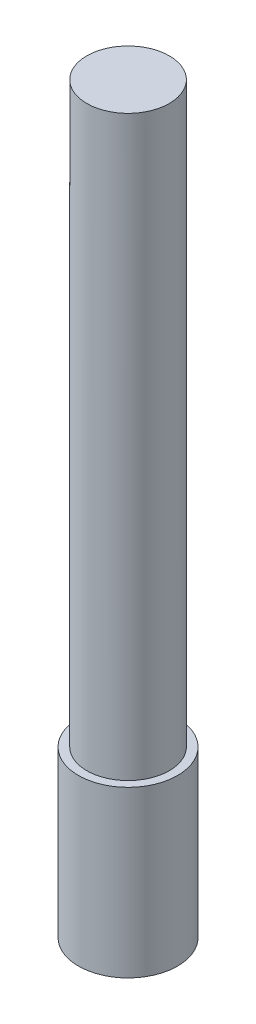
ISO-10303-21;
HEADER;
FILE_DESCRIPTION(('STEP AP214'),'2;1');
FILE_NAME('part.step','',(''),(''),'','','');
FILE_SCHEMA(('AUTOMOTIVE_DESIGN { 1 0 10303 214 1 1 1 1 }'));
ENDSEC;
DATA;
#1=APPLICATION_CONTEXT('core data for automotive mechanical design processes');
#2=APPLICATION_PROTOCOL_DEFINITION('international standard','automotive_design',2000,#1);
#3=PRODUCT_CONTEXT('',#1,'mechanical');
#4=PRODUCT('Part','Part','',(#3));
#5=PRODUCT_RELATED_PRODUCT_CATEGORY('part','',(#4));
#6=PRODUCT_DEFINITION_FORMATION('','',#4);
#7=PRODUCT_DEFINITION_CONTEXT('part definition',#1,'design');
#8=PRODUCT_DEFINITION('design','',#6,#7);
#9=PRODUCT_DEFINITION_SHAPE('','',#8);
#10=(LENGTH_UNIT() NAMED_UNIT(*) SI_UNIT(.MILLI.,.METRE.));
#11=(NAMED_UNIT(*) PLANE_ANGLE_UNIT() SI_UNIT($,.RADIAN.));
#12=(NAMED_UNIT(*) SI_UNIT($,.STERADIAN.) SOLID_ANGLE_UNIT());
#13=UNCERTAINTY_MEASURE_WITH_UNIT(LENGTH_MEASURE(1.E-05),#10,'distance_accuracy_value','');
#14=(GEOMETRIC_REPRESENTATION_CONTEXT(3) GLOBAL_UNCERTAINTY_ASSIGNED_CONTEXT((#13)) GLOBAL_UNIT_ASSIGNED_CONTEXT((#10,
#11,#12)) REPRESENTATION_CONTEXT('',''));
#15=CARTESIAN_POINT('',(0.,0.,0.));
#16=DIRECTION('',(0.,0.,1.));
#17=DIRECTION('',(1.,0.,0.));
#18=AXIS2_PLACEMENT_3D('',#15,#16,#17);
#19=CARTESIAN_POINT('',(0.,0.,0.));
#20=DIRECTION('',(0.,-1.,0.));
#21=DIRECTION('',(0.,0.,-1.));
#22=AXIS2_PLACEMENT_3D('',#19,#20,#21);
#23=CYLINDRICAL_SURFACE('',#22,0.5);
#24=CARTESIAN_POINT('',(0.,0.,0.));
#25=DIRECTION('',(0.,1.,0.));
#26=DIRECTION('',(0.,0.,1.));
#27=AXIS2_PLACEMENT_3D('',#24,#25,#26);
#28=CIRCLE('',#27,0.5);
#29=CARTESIAN_POINT('',(0.,0.,0.5));
#30=VERTEX_POINT('',#29);
#31=EDGE_CURVE('E38',#30,#30,#28,.T.);
#32=ORIENTED_EDGE('',*,*,#31,.F.);
#33=EDGE_LOOP('',(#32));
#34=FACE_BOUND('',#33,.T.);
#35=CARTESIAN_POINT('',(0.,-7.,0.));
#36=DIRECTION('',(0.,-1.,0.));
#37=DIRECTION('',(0.,0.,-1.));
#38=AXIS2_PLACEMENT_3D('',#35,#36,#37);
#39=CIRCLE('',#38,0.5);
#40=CARTESIAN_POINT('',(0.,-7.,-0.5));
#41=VERTEX_POINT('',#40);
#42=EDGE_CURVE('E10',#41,#41,#39,.T.);
#43=ORIENTED_EDGE('',*,*,#42,.F.);
#44=EDGE_LOOP('',(#43));
#45=FACE_BOUND('',#44,.T.);
#46=ADVANCED_FACE('F31',(#34,#45),#23,.T.);
#47=CARTESIAN_POINT('',(0.,0.,0.));
#48=DIRECTION('',(0.,1.,0.));
#49=DIRECTION('',(0.,0.,1.));
#50=AXIS2_PLACEMENT_3D('',#47,#48,#49);
#51=PLANE('',#50);
#52=ORIENTED_EDGE('',*,*,#31,.T.);
#53=EDGE_LOOP('',(#52));
#54=FACE_BOUND('',#53,.T.);
#55=ADVANCED_FACE('F33',(#54),#51,.T.);
#56=CARTESIAN_POINT('',(0.,-7.,0.));
#57=DIRECTION('',(0.,-1.,0.));
#58=DIRECTION('',(0.,0.,-1.));
#59=AXIS2_PLACEMENT_3D('',#56,#57,#58);
#60=CYLINDRICAL_SURFACE('',#59,0.6);
#61=CARTESIAN_POINT('',(0.,-7.,0.));
#62=DIRECTION('',(0.,-1.,0.));
#63=DIRECTION('',(0.,0.,-1.));
#64=AXIS2_PLACEMENT_3D('',#61,#62,#63);
#65=CIRCLE('',#64,0.6);
#66=CARTESIAN_POINT('',(0.,-7.,-0.6));
#67=VERTEX_POINT('',#66);
#68=EDGE_CURVE('E42',#67,#67,#65,.T.);
#69=ORIENTED_EDGE('',*,*,#68,.T.);
#70=EDGE_LOOP('',(#69));
#71=FACE_BOUND('',#70,.T.);
#72=CARTESIAN_POINT('',(0.,-9.,0.));
#73=DIRECTION('',(0.,-1.,0.));
#74=DIRECTION('',(0.,0.,-1.));
#75=AXIS2_PLACEMENT_3D('',#72,#73,#74);
#76=CIRCLE('',#75,0.6);
#77=CARTESIAN_POINT('',(0.,-9.,-0.6));
#78=VERTEX_POINT('',#77);
#79=EDGE_CURVE('E46',#78,#78,#76,.T.);
#80=ORIENTED_EDGE('',*,*,#79,.F.);
#81=EDGE_LOOP('',(#80));
#82=FACE_BOUND('',#81,.T.);
#83=ADVANCED_FACE('F54',(#71,#82),#60,.T.);
#84=CARTESIAN_POINT('',(0.,-7.,0.));
#85=DIRECTION('',(0.,-1.,0.));
#86=DIRECTION('',(0.,0.,-1.));
#87=AXIS2_PLACEMENT_3D('',#84,#85,#86);
#88=PLANE('',#87);
#89=ORIENTED_EDGE('',*,*,#42,.T.);
#90=EDGE_LOOP('',(#89));
#91=FACE_BOUND('',#90,.T.);
#92=ORIENTED_EDGE('',*,*,#68,.F.);
#93=EDGE_LOOP('',(#92));
#94=FACE_BOUND('',#93,.T.);
#95=ADVANCED_FACE('F56',(#91,#94),#88,.F.);
#96=CARTESIAN_POINT('',(0.,-9.,0.));
#97=DIRECTION('',(0.,1.,0.));
#98=DIRECTION('',(0.,0.,1.));
#99=AXIS2_PLACEMENT_3D('',#96,#97,#98);
#100=PLANE('',#99);
#101=ORIENTED_EDGE('',*,*,#79,.T.);
#102=EDGE_LOOP('',(#101));
#103=FACE_BOUND('',#102,.T.);
#104=ADVANCED_FACE('F52',(#103),#100,.F.);
#105=CLOSED_SHELL('',(#46,#55,#83,#95,#104));
#106=MANIFOLD_SOLID_BREP('B2',#105);
#107=ADVANCED_BREP_SHAPE_REPRESENTATION('',(#18,#106),#14);
#108=SHAPE_DEFINITION_REPRESENTATION(#9,#107);
ENDSEC;
END-ISO-10303-21;
